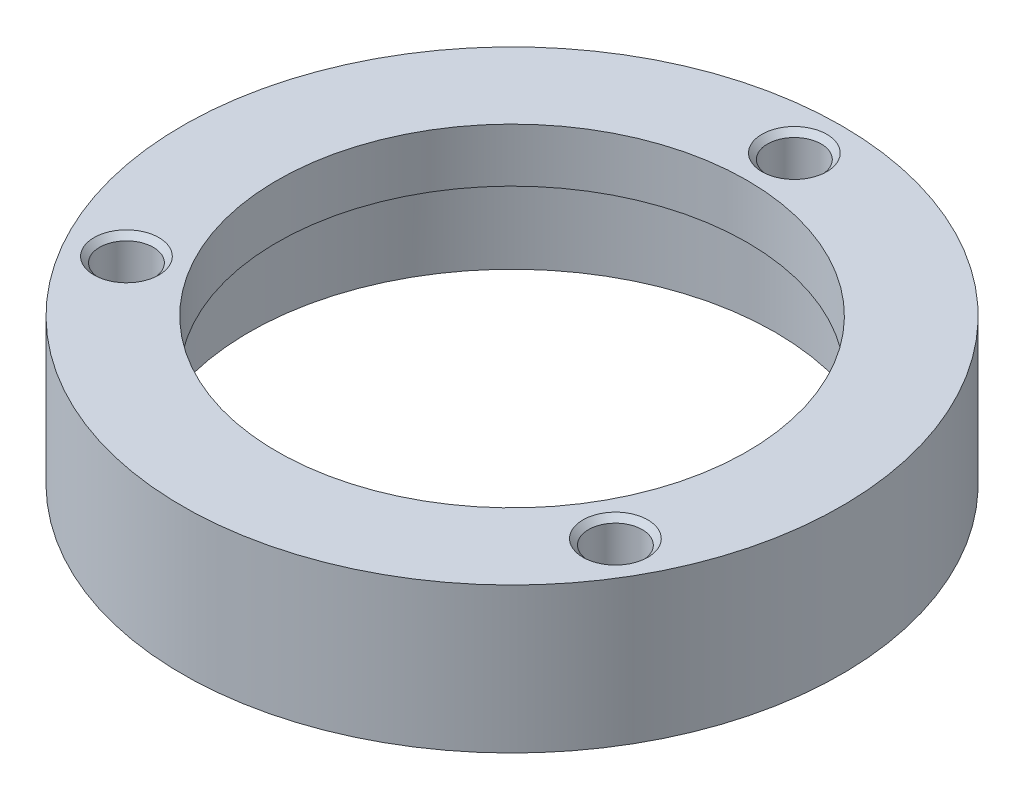
ISO-10303-21;
HEADER;
FILE_DESCRIPTION(('STEP AP214'),'2;1');
FILE_NAME('part.step','',(''),(''),'','','');
FILE_SCHEMA(('AUTOMOTIVE_DESIGN { 1 0 10303 214 1 1 1 1 }'));
ENDSEC;
DATA;
#1=APPLICATION_CONTEXT('core data for automotive mechanical design processes');
#2=APPLICATION_PROTOCOL_DEFINITION('international standard','automotive_design',2000,#1);
#3=PRODUCT_CONTEXT('',#1,'mechanical');
#4=PRODUCT('Part','Part','',(#3));
#5=PRODUCT_RELATED_PRODUCT_CATEGORY('part','',(#4));
#6=PRODUCT_DEFINITION_FORMATION('','',#4);
#7=PRODUCT_DEFINITION_CONTEXT('part definition',#1,'design');
#8=PRODUCT_DEFINITION('design','',#6,#7);
#9=PRODUCT_DEFINITION_SHAPE('','',#8);
#10=(LENGTH_UNIT() NAMED_UNIT(*) SI_UNIT(.MILLI.,.METRE.));
#11=(NAMED_UNIT(*) PLANE_ANGLE_UNIT() SI_UNIT($,.RADIAN.));
#12=(NAMED_UNIT(*) SI_UNIT($,.STERADIAN.) SOLID_ANGLE_UNIT());
#13=UNCERTAINTY_MEASURE_WITH_UNIT(LENGTH_MEASURE(1.E-05),#10,'distance_accuracy_value','');
#14=(GEOMETRIC_REPRESENTATION_CONTEXT(3) GLOBAL_UNCERTAINTY_ASSIGNED_CONTEXT((#13)) GLOBAL_UNIT_ASSIGNED_CONTEXT((#10,
#11,#12)) REPRESENTATION_CONTEXT('',''));
#15=CARTESIAN_POINT('',(0.,0.,0.));
#16=DIRECTION('',(0.,0.,1.));
#17=DIRECTION('',(1.,0.,0.));
#18=AXIS2_PLACEMENT_3D('',#15,#16,#17);
#19=CARTESIAN_POINT('',(0.,13.,0.));
#20=DIRECTION('',(0.,1.,0.));
#21=DIRECTION('',(0.,0.,1.));
#22=AXIS2_PLACEMENT_3D('',#19,#20,#21);
#23=PLANE('',#22);
#24=CARTESIAN_POINT('',(-21.8454908104625,13.,12.6125));
#25=DIRECTION('',(0.,1.,0.));
#26=DIRECTION('',(0.,0.,1.));
#27=AXIS2_PLACEMENT_3D('',#24,#25,#26);
#28=CIRCLE('',#27,2.89999999999999);
#29=CARTESIAN_POINT('',(-21.8454908104625,13.,15.5125));
#30=VERTEX_POINT('',#29);
#31=EDGE_CURVE('E57',#30,#30,#28,.F.);
#32=ORIENTED_EDGE('',*,*,#31,.T.);
#33=EDGE_LOOP('',(#32));
#34=FACE_BOUND('',#33,.T.);
#35=CARTESIAN_POINT('',(21.8454908104625,13.,12.6125));
#36=DIRECTION('',(0.,1.,0.));
#37=DIRECTION('',(0.,0.,1.));
#38=AXIS2_PLACEMENT_3D('',#35,#36,#37);
#39=CIRCLE('',#38,2.90000000000012);
#40=CARTESIAN_POINT('',(21.8454908104625,13.,15.5125000000001));
#41=VERTEX_POINT('',#40);
#42=EDGE_CURVE('E62',#41,#41,#39,.F.);
#43=ORIENTED_EDGE('',*,*,#42,.T.);
#44=EDGE_LOOP('',(#43));
#45=FACE_BOUND('',#44,.T.);
#46=CARTESIAN_POINT('',(0.,13.,-25.225));
#47=DIRECTION('',(0.,1.,0.));
#48=DIRECTION('',(0.,0.,1.));
#49=AXIS2_PLACEMENT_3D('',#46,#47,#48);
#50=CIRCLE('',#49,2.90000000000003);
#51=CARTESIAN_POINT('',(0.,13.,-22.325));
#52=VERTEX_POINT('',#51);
#53=EDGE_CURVE('E65',#52,#52,#50,.F.);
#54=ORIENTED_EDGE('',*,*,#53,.T.);
#55=EDGE_LOOP('',(#54));
#56=FACE_BOUND('',#55,.T.);
#57=CARTESIAN_POINT('',(0.,13.,0.));
#58=DIRECTION('',(0.,1.,0.));
#59=DIRECTION('',(0.,0.,1.));
#60=AXIS2_PLACEMENT_3D('',#57,#58,#59);
#61=CIRCLE('',#60,29.45);
#62=CARTESIAN_POINT('',(0.,13.,-29.45));
#63=VERTEX_POINT('',#62);
#64=EDGE_CURVE('E71',#63,#63,#61,.T.);
#65=ORIENTED_EDGE('',*,*,#64,.T.);
#66=EDGE_LOOP('',(#65));
#67=FACE_BOUND('',#66,.T.);
#68=CARTESIAN_POINT('',(0.,13.,0.));
#69=DIRECTION('',(0.,1.,0.));
#70=DIRECTION('',(0.,0.,1.));
#71=AXIS2_PLACEMENT_3D('',#68,#69,#70);
#72=CIRCLE('',#71,21.);
#73=CARTESIAN_POINT('',(0.,13.,-21.));
#74=VERTEX_POINT('',#73);
#75=EDGE_CURVE('E75',#74,#74,#72,.T.);
#76=ORIENTED_EDGE('',*,*,#75,.F.);
#77=EDGE_LOOP('',(#76));
#78=FACE_BOUND('',#77,.T.);
#79=ADVANCED_FACE('F44',(#34,#45,#56,#67,#78),#23,.T.);
#80=CARTESIAN_POINT('',(0.,0.,0.));
#81=DIRECTION('',(0.,1.,0.));
#82=DIRECTION('',(0.,0.,1.));
#83=AXIS2_PLACEMENT_3D('',#80,#81,#82);
#84=PLANE('',#83);
#85=CARTESIAN_POINT('',(0.,0.,0.));
#86=DIRECTION('',(0.,-1.,0.));
#87=DIRECTION('',(0.,0.,-1.));
#88=AXIS2_PLACEMENT_3D('',#85,#86,#87);
#89=CIRCLE('',#88,23.5);
#90=CARTESIAN_POINT('',(0.,0.,-23.5));
#91=VERTEX_POINT('',#90);
#92=EDGE_CURVE('E92',#91,#91,#89,.T.);
#93=ORIENTED_EDGE('',*,*,#92,.F.);
#94=EDGE_LOOP('',(#93));
#95=FACE_BOUND('',#94,.T.);
#96=CARTESIAN_POINT('',(0.,0.,0.));
#97=DIRECTION('',(0.,1.,0.));
#98=DIRECTION('',(0.,0.,1.));
#99=AXIS2_PLACEMENT_3D('',#96,#97,#98);
#100=CIRCLE('',#99,29.45);
#101=CARTESIAN_POINT('',(0.,0.,-29.45));
#102=VERTEX_POINT('',#101);
#103=EDGE_CURVE('E72',#102,#102,#100,.T.);
#104=ORIENTED_EDGE('',*,*,#103,.F.);
#105=EDGE_LOOP('',(#104));
#106=FACE_BOUND('',#105,.T.);
#107=ADVANCED_FACE('F99',(#95,#106),#84,.F.);
#108=CARTESIAN_POINT('',(0.,13.,0.));
#109=DIRECTION('',(0.,-1.,0.));
#110=DIRECTION('',(0.,0.,-1.));
#111=AXIS2_PLACEMENT_3D('',#108,#109,#110);
#112=CYLINDRICAL_SURFACE('',#111,29.45);
#113=CARTESIAN_POINT('',(0.,13.,-29.45));
#114=CARTESIAN_POINT('',(0.,12.8645833333333,-29.45));
#115=CARTESIAN_POINT('',(0.,12.7291666666667,-29.45));
#116=CARTESIAN_POINT('',(0.,12.4583333333333,-29.45));
#117=CARTESIAN_POINT('',(0.,12.3229166666667,-29.45));
#118=CARTESIAN_POINT('',(0.,12.0520833333333,-29.45));
#119=CARTESIAN_POINT('',(0.,11.9166666666667,-29.45));
#120=CARTESIAN_POINT('',(0.,11.6458333333333,-29.45));
#121=CARTESIAN_POINT('',(0.,11.5104166666667,-29.45));
#122=CARTESIAN_POINT('',(0.,11.2395833333333,-29.45));
#123=CARTESIAN_POINT('',(0.,11.1041666666667,-29.45));
#124=CARTESIAN_POINT('',(0.,10.8333333333333,-29.45));
#125=CARTESIAN_POINT('',(0.,10.6979166666667,-29.45));
#126=CARTESIAN_POINT('',(0.,10.4270833333333,-29.45));
#127=CARTESIAN_POINT('',(0.,10.2916666666667,-29.45));
#128=CARTESIAN_POINT('',(0.,10.0208333333333,-29.45));
#129=CARTESIAN_POINT('',(0.,9.88541666666667,-29.45));
#130=CARTESIAN_POINT('',(0.,9.61458333333333,-29.45));
#131=CARTESIAN_POINT('',(0.,9.47916666666667,-29.45));
#132=CARTESIAN_POINT('',(0.,9.20833333333333,-29.45));
#133=CARTESIAN_POINT('',(0.,9.07291666666666,-29.45));
#134=CARTESIAN_POINT('',(0.,8.80208333333333,-29.45));
#135=CARTESIAN_POINT('',(0.,8.66666666666667,-29.45));
#136=CARTESIAN_POINT('',(0.,8.39583333333333,-29.45));
#137=CARTESIAN_POINT('',(0.,8.26041666666667,-29.45));
#138=CARTESIAN_POINT('',(0.,7.98958333333333,-29.45));
#139=CARTESIAN_POINT('',(0.,7.85416666666667,-29.45));
#140=CARTESIAN_POINT('',(0.,7.58333333333333,-29.45));
#141=CARTESIAN_POINT('',(0.,7.44791666666667,-29.45));
#142=CARTESIAN_POINT('',(0.,7.17708333333333,-29.45));
#143=CARTESIAN_POINT('',(0.,7.04166666666667,-29.45));
#144=CARTESIAN_POINT('',(0.,6.77083333333333,-29.45));
#145=CARTESIAN_POINT('',(0.,6.63541666666667,-29.45));
#146=CARTESIAN_POINT('',(0.,6.36458333333333,-29.45));
#147=CARTESIAN_POINT('',(0.,6.22916666666667,-29.45));
#148=CARTESIAN_POINT('',(0.,5.95833333333333,-29.45));
#149=CARTESIAN_POINT('',(0.,5.82291666666667,-29.45));
#150=CARTESIAN_POINT('',(0.,5.55208333333333,-29.45));
#151=CARTESIAN_POINT('',(0.,5.41666666666667,-29.45));
#152=CARTESIAN_POINT('',(0.,5.14583333333333,-29.45));
#153=CARTESIAN_POINT('',(0.,5.01041666666667,-29.45));
#154=CARTESIAN_POINT('',(0.,4.73958333333333,-29.45));
#155=CARTESIAN_POINT('',(0.,4.60416666666667,-29.45));
#156=CARTESIAN_POINT('',(0.,4.33333333333333,-29.45));
#157=CARTESIAN_POINT('',(0.,4.19791666666667,-29.45));
#158=CARTESIAN_POINT('',(0.,3.92708333333333,-29.45));
#159=CARTESIAN_POINT('',(0.,3.79166666666667,-29.45));
#160=CARTESIAN_POINT('',(0.,3.52083333333333,-29.45));
#161=CARTESIAN_POINT('',(0.,3.38541666666667,-29.45));
#162=CARTESIAN_POINT('',(0.,3.11458333333333,-29.45));
#163=CARTESIAN_POINT('',(0.,2.97916666666667,-29.45));
#164=CARTESIAN_POINT('',(0.,2.70833333333333,-29.45));
#165=CARTESIAN_POINT('',(0.,2.57291666666667,-29.45));
#166=CARTESIAN_POINT('',(0.,2.30208333333333,-29.45));
#167=CARTESIAN_POINT('',(0.,2.16666666666667,-29.45));
#168=CARTESIAN_POINT('',(0.,1.89583333333333,-29.45));
#169=CARTESIAN_POINT('',(0.,1.76041666666667,-29.45));
#170=CARTESIAN_POINT('',(0.,1.48958333333333,-29.45));
#171=CARTESIAN_POINT('',(0.,1.35416666666667,-29.45));
#172=CARTESIAN_POINT('',(0.,1.08333333333333,-29.45));
#173=CARTESIAN_POINT('',(0.,0.947916666666667,-29.45));
#174=CARTESIAN_POINT('',(0.,0.677083333333334,-29.45));
#175=CARTESIAN_POINT('',(0.,0.541666666666667,-29.45));
#176=CARTESIAN_POINT('',(0.,0.270833333333334,-29.45));
#177=CARTESIAN_POINT('',(0.,0.135416666666667,-29.45));
#178=CARTESIAN_POINT('',(0.,0.,-29.45));
#179=B_SPLINE_CURVE_WITH_KNOTS('',3,(#113,#114,#115,#116,#117,#118,#119,#120,#121,#122,#123,
#124,#125,#126,#127,#128,#129,#130,#131,#132,#133,#134,#135,#136,#137,#138,#139,#140,#141,#142,
#143,#144,#145,#146,#147,#148,#149,#150,#151,#152,#153,#154,#155,#156,#157,#158,#159,#160,#161,
#162,#163,#164,#165,#166,#167,#168,#169,#170,#171,#172,#173,#174,#175,#176,#177,#178),
.UNSPECIFIED.,.F.,.F.,(4,2,2,2,2,2,2,2,2,2,2,2,2,2,2,2,2,2,2,2,2,2,2,2,2,2,2,2,2,2,2,2,4),(0.,
0.40625,0.812500000000001,1.21875,1.625,2.03125,2.4375,2.84375,3.25,3.65625,4.0625,4.46875,
4.875,5.28125,5.6875,6.09375,6.5,6.90625,7.3125,7.71875,8.125,8.53125,8.9375,9.34375,9.75,
10.15625,10.5625,10.96875,11.375,11.78125,12.1875,12.59375,13.),.UNSPECIFIED.);
#180=EDGE_CURVE('BSEAM102',#63,#102,#179,.T.);
#181=ORIENTED_EDGE('',*,*,#64,.F.);
#182=ORIENTED_EDGE('',*,*,#103,.T.);
#183=ORIENTED_EDGE('',*,*,#180,.T.);
#184=ORIENTED_EDGE('',*,*,#180,.F.);
#185=EDGE_LOOP('',(#181,#183,#182,#184));
#186=FACE_BOUND('',#185,.T.);
#187=ADVANCED_FACE('F102',(#186),#112,.T.);
#188=CARTESIAN_POINT('',(0.,13.,0.));
#189=DIRECTION('',(0.,-1.,0.));
#190=DIRECTION('',(0.,0.,-1.));
#191=AXIS2_PLACEMENT_3D('',#188,#189,#190);
#192=CYLINDRICAL_SURFACE('',#191,21.);
#193=CARTESIAN_POINT('',(0.,8.2,0.));
#194=DIRECTION('',(0.,1.,0.));
#195=DIRECTION('',(0.,0.,1.));
#196=AXIS2_PLACEMENT_3D('',#193,#194,#195);
#197=CIRCLE('',#196,21.);
#198=CARTESIAN_POINT('',(0.,8.2,-21.));
#199=VERTEX_POINT('',#198);
#200=EDGE_CURVE('E49',#199,#199,#197,.T.);
#201=CARTESIAN_POINT('',(0.,8.2,-21.));
#202=CARTESIAN_POINT('',(0.,8.25,-21.));
#203=CARTESIAN_POINT('',(0.,8.3,-21.));
#204=CARTESIAN_POINT('',(0.,8.4,-21.));
#205=CARTESIAN_POINT('',(0.,8.45,-21.));
#206=CARTESIAN_POINT('',(0.,8.55,-21.));
#207=CARTESIAN_POINT('',(0.,8.6,-21.));
#208=CARTESIAN_POINT('',(0.,8.7,-21.));
#209=CARTESIAN_POINT('',(0.,8.75,-21.));
#210=CARTESIAN_POINT('',(0.,8.85,-21.));
#211=CARTESIAN_POINT('',(0.,8.9,-21.));
#212=CARTESIAN_POINT('',(0.,9.,-21.));
#213=CARTESIAN_POINT('',(0.,9.05,-21.));
#214=CARTESIAN_POINT('',(0.,9.15,-21.));
#215=CARTESIAN_POINT('',(0.,9.2,-21.));
#216=CARTESIAN_POINT('',(0.,9.3,-21.));
#217=CARTESIAN_POINT('',(0.,9.35,-21.));
#218=CARTESIAN_POINT('',(0.,9.45,-21.));
#219=CARTESIAN_POINT('',(0.,9.5,-21.));
#220=CARTESIAN_POINT('',(0.,9.6,-21.));
#221=CARTESIAN_POINT('',(0.,9.65,-21.));
#222=CARTESIAN_POINT('',(0.,9.75,-21.));
#223=CARTESIAN_POINT('',(0.,9.8,-21.));
#224=CARTESIAN_POINT('',(0.,9.9,-21.));
#225=CARTESIAN_POINT('',(0.,9.95,-21.));
#226=CARTESIAN_POINT('',(0.,10.05,-21.));
#227=CARTESIAN_POINT('',(0.,10.1,-21.));
#228=CARTESIAN_POINT('',(0.,10.2,-21.));
#229=CARTESIAN_POINT('',(0.,10.25,-21.));
#230=CARTESIAN_POINT('',(0.,10.35,-21.));
#231=CARTESIAN_POINT('',(0.,10.4,-21.));
#232=CARTESIAN_POINT('',(0.,10.5,-21.));
#233=CARTESIAN_POINT('',(0.,10.55,-21.));
#234=CARTESIAN_POINT('',(0.,10.65,-21.));
#235=CARTESIAN_POINT('',(0.,10.7,-21.));
#236=CARTESIAN_POINT('',(0.,10.8,-21.));
#237=CARTESIAN_POINT('',(0.,10.85,-21.));
#238=CARTESIAN_POINT('',(0.,10.95,-21.));
#239=CARTESIAN_POINT('',(0.,11.,-21.));
#240=CARTESIAN_POINT('',(0.,11.1,-21.));
#241=CARTESIAN_POINT('',(0.,11.15,-21.));
#242=CARTESIAN_POINT('',(0.,11.25,-21.));
#243=CARTESIAN_POINT('',(0.,11.3,-21.));
#244=CARTESIAN_POINT('',(0.,11.4,-21.));
#245=CARTESIAN_POINT('',(0.,11.45,-21.));
#246=CARTESIAN_POINT('',(0.,11.55,-21.));
#247=CARTESIAN_POINT('',(0.,11.6,-21.));
#248=CARTESIAN_POINT('',(0.,11.7,-21.));
#249=CARTESIAN_POINT('',(0.,11.75,-21.));
#250=CARTESIAN_POINT('',(0.,11.85,-21.));
#251=CARTESIAN_POINT('',(0.,11.9,-21.));
#252=CARTESIAN_POINT('',(0.,12.,-21.));
#253=CARTESIAN_POINT('',(0.,12.05,-21.));
#254=CARTESIAN_POINT('',(0.,12.15,-21.));
#255=CARTESIAN_POINT('',(0.,12.2,-21.));
#256=CARTESIAN_POINT('',(0.,12.3,-21.));
#257=CARTESIAN_POINT('',(0.,12.35,-21.));
#258=CARTESIAN_POINT('',(0.,12.45,-21.));
#259=CARTESIAN_POINT('',(0.,12.5,-21.));
#260=CARTESIAN_POINT('',(0.,12.6,-21.));
#261=CARTESIAN_POINT('',(0.,12.65,-21.));
#262=CARTESIAN_POINT('',(0.,12.75,-21.));
#263=CARTESIAN_POINT('',(0.,12.8,-21.));
#264=CARTESIAN_POINT('',(0.,12.9,-21.));
#265=CARTESIAN_POINT('',(0.,12.95,-21.));
#266=CARTESIAN_POINT('',(0.,13.,-21.));
#267=B_SPLINE_CURVE_WITH_KNOTS('',3,(#201,#202,#203,#204,#205,#206,#207,#208,#209,#210,#211,
#212,#213,#214,#215,#216,#217,#218,#219,#220,#221,#222,#223,#224,#225,#226,#227,#228,#229,#230,
#231,#232,#233,#234,#235,#236,#237,#238,#239,#240,#241,#242,#243,#244,#245,#246,#247,#248,#249,
#250,#251,#252,#253,#254,#255,#256,#257,#258,#259,#260,#261,#262,#263,#264,#265,#266),
.UNSPECIFIED.,.F.,.F.,(4,2,2,2,2,2,2,2,2,2,2,2,2,2,2,2,2,2,2,2,2,2,2,2,2,2,2,2,2,2,2,2,4),(0.,
0.149999999999999,0.299999999999998,0.449999999999999,0.6,0.750000000000001,0.899999999999998,
1.05,1.2,1.35,1.5,1.65,1.8,1.95,2.1,2.25,2.4,2.55,2.7,2.85,3.,3.15,3.3,3.45,3.6,3.75,3.9,4.05,
4.2,4.35,4.5,4.65,4.8),.UNSPECIFIED.);
#268=EDGE_CURVE('BSEAM107',#199,#74,#267,.T.);
#269=ORIENTED_EDGE('',*,*,#200,.F.);
#270=ORIENTED_EDGE('',*,*,#75,.T.);
#271=ORIENTED_EDGE('',*,*,#268,.T.);
#272=ORIENTED_EDGE('',*,*,#268,.F.);
#273=EDGE_LOOP('',(#269,#271,#270,#272));
#274=FACE_BOUND('',#273,.T.);
#275=ADVANCED_FACE('F107',(#274),#192,.F.);
#276=CARTESIAN_POINT('',(-21.8454908104625,9.,12.6125));
#277=DIRECTION('',(0.,1.,0.));
#278=DIRECTION('',(0.,0.,1.));
#279=AXIS2_PLACEMENT_3D('',#276,#277,#278);
#280=CYLINDRICAL_SURFACE('',#279,2.4);
#281=CARTESIAN_POINT('',(-21.8454908104625,12.5,12.6125));
#282=DIRECTION('',(0.,1.,0.));
#283=DIRECTION('',(0.,0.,1.));
#284=AXIS2_PLACEMENT_3D('',#281,#282,#283);
#285=CIRCLE('',#284,2.4);
#286=CARTESIAN_POINT('',(-21.8454908104625,12.5,15.0125));
#287=VERTEX_POINT('',#286);
#288=EDGE_CURVE('E68',#287,#287,#285,.T.);
#289=ORIENTED_EDGE('',*,*,#288,.T.);
#290=EDGE_LOOP('',(#289));
#291=FACE_BOUND('',#290,.T.);
#292=CARTESIAN_POINT('',(-21.8454908104625,9.,12.6125));
#293=DIRECTION('',(0.,1.,0.));
#294=DIRECTION('',(0.,0.,1.));
#295=AXIS2_PLACEMENT_3D('',#292,#293,#294);
#296=CIRCLE('',#295,2.4);
#297=CARTESIAN_POINT('',(-21.8454908104625,9.,15.0125));
#298=VERTEX_POINT('',#297);
#299=EDGE_CURVE('E81',#298,#298,#296,.T.);
#300=ORIENTED_EDGE('',*,*,#299,.F.);
#301=EDGE_LOOP('',(#300));
#302=FACE_BOUND('',#301,.T.);
#303=ADVANCED_FACE('F114',(#291,#302),#280,.F.);
#304=CARTESIAN_POINT('',(-21.8454908104625,9.,12.6125));
#305=DIRECTION('',(0.,1.,0.));
#306=DIRECTION('',(0.,0.,1.));
#307=AXIS2_PLACEMENT_3D('',#304,#305,#306);
#308=PLANE('',#307);
#309=ORIENTED_EDGE('',*,*,#299,.T.);
#310=EDGE_LOOP('',(#309));
#311=FACE_BOUND('',#310,.T.);
#312=ADVANCED_FACE('F128',(#311),#308,.T.);
#313=CARTESIAN_POINT('',(21.8454908104625,9.,12.6125));
#314=DIRECTION('',(0.,1.,0.));
#315=DIRECTION('',(0.,0.,1.));
#316=AXIS2_PLACEMENT_3D('',#313,#314,#315);
#317=CYLINDRICAL_SURFACE('',#316,2.40000000000012);
#318=CARTESIAN_POINT('',(21.8454908104625,12.5,12.6125));
#319=DIRECTION('',(0.,1.,0.));
#320=DIRECTION('',(0.,0.,1.));
#321=AXIS2_PLACEMENT_3D('',#318,#319,#320);
#322=CIRCLE('',#321,2.40000000000012);
#323=CARTESIAN_POINT('',(21.8454908104625,12.5,15.0125000000001));
#324=VERTEX_POINT('',#323);
#325=EDGE_CURVE('E53',#324,#324,#322,.T.);
#326=ORIENTED_EDGE('',*,*,#325,.T.);
#327=EDGE_LOOP('',(#326));
#328=FACE_BOUND('',#327,.T.);
#329=CARTESIAN_POINT('',(21.8454908104625,9.,12.6125));
#330=DIRECTION('',(0.,1.,0.));
#331=DIRECTION('',(0.,0.,1.));
#332=AXIS2_PLACEMENT_3D('',#329,#330,#331);
#333=CIRCLE('',#332,2.40000000000012);
#334=CARTESIAN_POINT('',(21.8454908104625,9.,15.0125000000001));
#335=VERTEX_POINT('',#334);
#336=EDGE_CURVE('E84',#335,#335,#333,.T.);
#337=ORIENTED_EDGE('',*,*,#336,.F.);
#338=EDGE_LOOP('',(#337));
#339=FACE_BOUND('',#338,.T.);
#340=ADVANCED_FACE('F130',(#328,#339),#317,.F.);
#341=CARTESIAN_POINT('',(21.8454908104625,9.,12.6125));
#342=DIRECTION('',(0.,1.,0.));
#343=DIRECTION('',(0.,0.,1.));
#344=AXIS2_PLACEMENT_3D('',#341,#342,#343);
#345=PLANE('',#344);
#346=ORIENTED_EDGE('',*,*,#336,.T.);
#347=EDGE_LOOP('',(#346));
#348=FACE_BOUND('',#347,.T.);
#349=ADVANCED_FACE('F134',(#348),#345,.T.);
#350=CARTESIAN_POINT('',(0.,9.,-25.225));
#351=DIRECTION('',(0.,1.,0.));
#352=DIRECTION('',(0.,0.,1.));
#353=AXIS2_PLACEMENT_3D('',#350,#351,#352);
#354=CYLINDRICAL_SURFACE('',#353,2.4);
#355=CARTESIAN_POINT('',(0.,12.5,-25.225));
#356=DIRECTION('',(0.,1.,0.));
#357=DIRECTION('',(0.,0.,1.));
#358=AXIS2_PLACEMENT_3D('',#355,#356,#357);
#359=CIRCLE('',#358,2.4);
#360=CARTESIAN_POINT('',(0.,12.5,-22.825));
#361=VERTEX_POINT('',#360);
#362=EDGE_CURVE('E11',#361,#361,#359,.T.);
#363=ORIENTED_EDGE('',*,*,#362,.T.);
#364=EDGE_LOOP('',(#363));
#365=FACE_BOUND('',#364,.T.);
#366=CARTESIAN_POINT('',(0.,9.,-25.225));
#367=DIRECTION('',(0.,1.,0.));
#368=DIRECTION('',(0.,0.,1.));
#369=AXIS2_PLACEMENT_3D('',#366,#367,#368);
#370=CIRCLE('',#369,2.4);
#371=CARTESIAN_POINT('',(0.,9.,-22.825));
#372=VERTEX_POINT('',#371);
#373=EDGE_CURVE('E80',#372,#372,#370,.T.);
#374=ORIENTED_EDGE('',*,*,#373,.F.);
#375=EDGE_LOOP('',(#374));
#376=FACE_BOUND('',#375,.T.);
#377=ADVANCED_FACE('F137',(#365,#376),#354,.F.);
#378=CARTESIAN_POINT('',(0.,9.,-25.225));
#379=DIRECTION('',(0.,1.,0.));
#380=DIRECTION('',(0.,0.,1.));
#381=AXIS2_PLACEMENT_3D('',#378,#379,#380);
#382=PLANE('',#381);
#383=ORIENTED_EDGE('',*,*,#373,.T.);
#384=EDGE_LOOP('',(#383));
#385=FACE_BOUND('',#384,.T.);
#386=ADVANCED_FACE('F144',(#385),#382,.T.);
#387=CARTESIAN_POINT('',(-21.8454908104625,12.5,12.6125));
#388=DIRECTION('',(0.,1.,0.));
#389=DIRECTION('',(0.,0.,1.));
#390=AXIS2_PLACEMENT_3D('',#387,#388,#389);
#391=CONICAL_SURFACE('',#390,2.4,0.785398163397454);
#392=ORIENTED_EDGE('',*,*,#31,.F.);
#393=EDGE_LOOP('',(#392));
#394=FACE_BOUND('',#393,.T.);
#395=ORIENTED_EDGE('',*,*,#288,.F.);
#396=EDGE_LOOP('',(#395));
#397=FACE_BOUND('',#396,.T.);
#398=ADVANCED_FACE('F146',(#394,#397),#391,.F.);
#399=CARTESIAN_POINT('',(21.8454908104625,12.5,12.6125));
#400=DIRECTION('',(0.,1.,0.));
#401=DIRECTION('',(0.,0.,1.));
#402=AXIS2_PLACEMENT_3D('',#399,#400,#401);
#403=CONICAL_SURFACE('',#402,2.40000000000012,0.785398163397454);
#404=ORIENTED_EDGE('',*,*,#42,.F.);
#405=EDGE_LOOP('',(#404));
#406=FACE_BOUND('',#405,.T.);
#407=ORIENTED_EDGE('',*,*,#325,.F.);
#408=EDGE_LOOP('',(#407));
#409=FACE_BOUND('',#408,.T.);
#410=ADVANCED_FACE('F178',(#406,#409),#403,.F.);
#411=CARTESIAN_POINT('',(0.,12.5,-25.225));
#412=DIRECTION('',(0.,1.,0.));
#413=DIRECTION('',(0.,0.,1.));
#414=AXIS2_PLACEMENT_3D('',#411,#412,#413);
#415=CONICAL_SURFACE('',#414,2.4,0.785398163397455);
#416=ORIENTED_EDGE('',*,*,#53,.F.);
#417=EDGE_LOOP('',(#416));
#418=FACE_BOUND('',#417,.T.);
#419=ORIENTED_EDGE('',*,*,#362,.F.);
#420=EDGE_LOOP('',(#419));
#421=FACE_BOUND('',#420,.T.);
#422=ADVANCED_FACE('F47',(#418,#421),#415,.F.);
#423=CARTESIAN_POINT('',(0.,8.2,0.));
#424=DIRECTION('',(0.,1.,0.));
#425=DIRECTION('',(0.,0.,1.));
#426=AXIS2_PLACEMENT_3D('',#423,#424,#425);
#427=PLANE('',#426);
#428=ORIENTED_EDGE('',*,*,#200,.T.);
#429=EDGE_LOOP('',(#428));
#430=FACE_BOUND('',#429,.T.);
#431=CARTESIAN_POINT('',(0.,8.2,0.));
#432=DIRECTION('',(0.,1.,0.));
#433=DIRECTION('',(0.,0.,1.));
#434=AXIS2_PLACEMENT_3D('',#431,#432,#433);
#435=CIRCLE('',#434,23.5);
#436=CARTESIAN_POINT('',(0.,8.2,23.5));
#437=VERTEX_POINT('',#436);
#438=EDGE_CURVE('E89',#437,#437,#435,.F.);
#439=ORIENTED_EDGE('',*,*,#438,.T.);
#440=EDGE_LOOP('',(#439));
#441=FACE_BOUND('',#440,.T.);
#442=ADVANCED_FACE('F148',(#430,#441),#427,.F.);
#443=CARTESIAN_POINT('',(0.,79.4680374315355,0.));
#444=DIRECTION('',(0.,-1.,0.));
#445=DIRECTION('',(0.,0.,-1.));
#446=AXIS2_PLACEMENT_3D('',#443,#444,#445);
#447=CYLINDRICAL_SURFACE('',#446,23.5);
#448=ORIENTED_EDGE('',*,*,#92,.T.);
#449=EDGE_LOOP('',(#448));
#450=FACE_BOUND('',#449,.T.);
#451=ORIENTED_EDGE('',*,*,#438,.F.);
#452=EDGE_LOOP('',(#451));
#453=FACE_BOUND('',#452,.T.);
#454=ADVANCED_FACE('F96',(#450,#453),#447,.F.);
#455=CLOSED_SHELL('',(#79,#107,#187,#275,#303,#312,#340,#349,#377,#386,#398,#410,#422,#442,#454));
#456=MANIFOLD_SOLID_BREP('B2',#455);
#457=ADVANCED_BREP_SHAPE_REPRESENTATION('',(#18,#456),#14);
#458=SHAPE_DEFINITION_REPRESENTATION(#9,#457);
ENDSEC;
END-ISO-10303-21;
